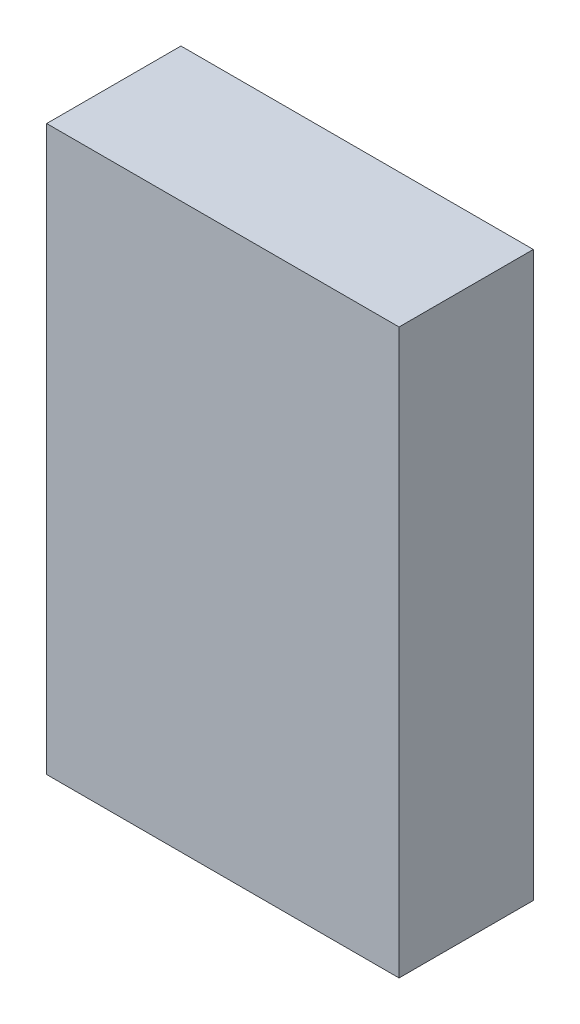
ISO-10303-21;
HEADER;
FILE_DESCRIPTION(('STEP AP214'),'2;1');
FILE_NAME('part.step','',(''),(''),'','','');
FILE_SCHEMA(('AUTOMOTIVE_DESIGN { 1 0 10303 214 1 1 1 1 }'));
ENDSEC;
DATA;
#1=APPLICATION_CONTEXT('core data for automotive mechanical design processes');
#2=APPLICATION_PROTOCOL_DEFINITION('international standard','automotive_design',2000,#1);
#3=PRODUCT_CONTEXT('',#1,'mechanical');
#4=PRODUCT('Part','Part','',(#3));
#5=PRODUCT_RELATED_PRODUCT_CATEGORY('part','',(#4));
#6=PRODUCT_DEFINITION_FORMATION('','',#4);
#7=PRODUCT_DEFINITION_CONTEXT('part definition',#1,'design');
#8=PRODUCT_DEFINITION('design','',#6,#7);
#9=PRODUCT_DEFINITION_SHAPE('','',#8);
#10=(LENGTH_UNIT() NAMED_UNIT(*) SI_UNIT(.MILLI.,.METRE.));
#11=(NAMED_UNIT(*) PLANE_ANGLE_UNIT() SI_UNIT($,.RADIAN.));
#12=(NAMED_UNIT(*) SI_UNIT($,.STERADIAN.) SOLID_ANGLE_UNIT());
#13=UNCERTAINTY_MEASURE_WITH_UNIT(LENGTH_MEASURE(1.E-05),#10,'distance_accuracy_value','');
#14=(GEOMETRIC_REPRESENTATION_CONTEXT(3) GLOBAL_UNCERTAINTY_ASSIGNED_CONTEXT((#13)) GLOBAL_UNIT_ASSIGNED_CONTEXT((#10,
#11,#12)) REPRESENTATION_CONTEXT('',''));
#15=CARTESIAN_POINT('',(0.,0.,0.));
#16=DIRECTION('',(0.,0.,1.));
#17=DIRECTION('',(1.,0.,0.));
#18=AXIS2_PLACEMENT_3D('',#15,#16,#17);
#19=CARTESIAN_POINT('',(12.5,20.,9.525));
#20=DIRECTION('',(-1.,0.,0.));
#21=DIRECTION('',(0.,-1.,0.));
#22=AXIS2_PLACEMENT_3D('',#19,#20,#21);
#23=PLANE('',#22);
#24=DIRECTION('',(0.,1.,0.));
#25=VECTOR('',#24,1.);
#26=CARTESIAN_POINT('',(12.5,20.,0.));
#27=LINE('',#26,#25);
#28=CARTESIAN_POINT('',(12.5,-20.,0.));
#29=VERTEX_POINT('',#28);
#30=CARTESIAN_POINT('',(12.5,20.,0.));
#31=VERTEX_POINT('',#30);
#32=EDGE_CURVE('E97',#29,#31,#27,.T.);
#33=ORIENTED_EDGE('',*,*,#32,.T.);
#34=DIRECTION('',(0.,0.,-1.));
#35=VECTOR('',#34,1.);
#36=CARTESIAN_POINT('',(12.5,20.,9.525));
#37=LINE('',#36,#35);
#38=CARTESIAN_POINT('',(12.5,20.,9.525));
#39=VERTEX_POINT('',#38);
#40=EDGE_CURVE('E11',#39,#31,#37,.T.);
#41=ORIENTED_EDGE('',*,*,#40,.F.);
#42=DIRECTION('',(0.,1.,0.));
#43=VECTOR('',#42,1.);
#44=CARTESIAN_POINT('',(12.5,20.,9.525));
#45=LINE('',#44,#43);
#46=CARTESIAN_POINT('',(12.5,-20.,9.525));
#47=VERTEX_POINT('',#46);
#48=EDGE_CURVE('E85',#47,#39,#45,.T.);
#49=ORIENTED_EDGE('',*,*,#48,.F.);
#50=DIRECTION('',(0.,0.,-1.));
#51=VECTOR('',#50,1.);
#52=CARTESIAN_POINT('',(12.5,-20.,9.525));
#53=LINE('',#52,#51);
#54=EDGE_CURVE('E93',#47,#29,#53,.T.);
#55=ORIENTED_EDGE('',*,*,#54,.T.);
#56=EDGE_LOOP('',(#33,#41,#49,#55));
#57=FACE_BOUND('',#56,.T.);
#58=ADVANCED_FACE('F34',(#57),#23,.F.);
#59=CARTESIAN_POINT('',(-12.5,20.,9.525));
#60=DIRECTION('',(0.,-1.,0.));
#61=DIRECTION('',(0.,0.,-1.));
#62=AXIS2_PLACEMENT_3D('',#59,#60,#61);
#63=PLANE('',#62);
#64=DIRECTION('',(-1.,0.,0.));
#65=VECTOR('',#64,1.);
#66=CARTESIAN_POINT('',(-12.5,20.,0.));
#67=LINE('',#66,#65);
#68=CARTESIAN_POINT('',(-12.5,20.,0.));
#69=VERTEX_POINT('',#68);
#70=EDGE_CURVE('E89',#31,#69,#67,.T.);
#71=ORIENTED_EDGE('',*,*,#70,.T.);
#72=DIRECTION('',(0.,0.,-1.));
#73=VECTOR('',#72,1.);
#74=CARTESIAN_POINT('',(-12.5,20.,9.525));
#75=LINE('',#74,#73);
#76=CARTESIAN_POINT('',(-12.5,20.,9.525));
#77=VERTEX_POINT('',#76);
#78=EDGE_CURVE('E42',#77,#69,#75,.T.);
#79=ORIENTED_EDGE('',*,*,#78,.F.);
#80=DIRECTION('',(-1.,0.,0.));
#81=VECTOR('',#80,1.);
#82=CARTESIAN_POINT('',(-12.5,20.,9.525));
#83=LINE('',#82,#81);
#84=EDGE_CURVE('E80',#39,#77,#83,.T.);
#85=ORIENTED_EDGE('',*,*,#84,.F.);
#86=ORIENTED_EDGE('',*,*,#40,.T.);
#87=EDGE_LOOP('',(#71,#79,#85,#86));
#88=FACE_BOUND('',#87,.T.);
#89=ADVANCED_FACE('F88',(#88),#63,.F.);
#90=CARTESIAN_POINT('',(-12.5,20.,9.525));
#91=DIRECTION('',(1.,0.,0.));
#92=DIRECTION('',(0.,1.,0.));
#93=AXIS2_PLACEMENT_3D('',#90,#91,#92);
#94=PLANE('',#93);
#95=DIRECTION('',(0.,-1.,0.));
#96=VECTOR('',#95,1.);
#97=CARTESIAN_POINT('',(-12.5,20.,0.));
#98=LINE('',#97,#96);
#99=CARTESIAN_POINT('',(-12.5,-20.,0.));
#100=VERTEX_POINT('',#99);
#101=EDGE_CURVE('E67',#69,#100,#98,.T.);
#102=ORIENTED_EDGE('',*,*,#101,.T.);
#103=DIRECTION('',(0.,0.,-1.));
#104=VECTOR('',#103,1.);
#105=CARTESIAN_POINT('',(-12.5,-20.,9.525));
#106=LINE('',#105,#104);
#107=CARTESIAN_POINT('',(-12.5,-20.,9.525));
#108=VERTEX_POINT('',#107);
#109=EDGE_CURVE('E90',#108,#100,#106,.T.);
#110=ORIENTED_EDGE('',*,*,#109,.F.);
#111=DIRECTION('',(0.,-1.,0.));
#112=VECTOR('',#111,1.);
#113=CARTESIAN_POINT('',(-12.5,20.,9.525));
#114=LINE('',#113,#112);
#115=EDGE_CURVE('E83',#77,#108,#114,.T.);
#116=ORIENTED_EDGE('',*,*,#115,.F.);
#117=ORIENTED_EDGE('',*,*,#78,.T.);
#118=EDGE_LOOP('',(#102,#110,#116,#117));
#119=FACE_BOUND('',#118,.T.);
#120=ADVANCED_FACE('F91',(#119),#94,.F.);
#121=CARTESIAN_POINT('',(-12.5,-20.,9.525));
#122=DIRECTION('',(0.,1.,0.));
#123=DIRECTION('',(0.,0.,1.));
#124=AXIS2_PLACEMENT_3D('',#121,#122,#123);
#125=PLANE('',#124);
#126=DIRECTION('',(1.,0.,0.));
#127=VECTOR('',#126,1.);
#128=CARTESIAN_POINT('',(-12.5,-20.,0.));
#129=LINE('',#128,#127);
#130=EDGE_CURVE('E73',#100,#29,#129,.T.);
#131=ORIENTED_EDGE('',*,*,#130,.T.);
#132=ORIENTED_EDGE('',*,*,#54,.F.);
#133=DIRECTION('',(1.,0.,0.));
#134=VECTOR('',#133,1.);
#135=CARTESIAN_POINT('',(-12.5,-20.,9.525));
#136=LINE('',#135,#134);
#137=EDGE_CURVE('E50',#108,#47,#136,.T.);
#138=ORIENTED_EDGE('',*,*,#137,.F.);
#139=ORIENTED_EDGE('',*,*,#109,.T.);
#140=EDGE_LOOP('',(#131,#132,#138,#139));
#141=FACE_BOUND('',#140,.T.);
#142=ADVANCED_FACE('F104',(#141),#125,.F.);
#143=CARTESIAN_POINT('',(0.,0.,9.525));
#144=DIRECTION('',(0.,0.,1.));
#145=DIRECTION('',(1.,0.,0.));
#146=AXIS2_PLACEMENT_3D('',#143,#144,#145);
#147=PLANE('',#146);
#148=ORIENTED_EDGE('',*,*,#48,.T.);
#149=ORIENTED_EDGE('',*,*,#84,.T.);
#150=ORIENTED_EDGE('',*,*,#115,.T.);
#151=ORIENTED_EDGE('',*,*,#137,.T.);
#152=EDGE_LOOP('',(#148,#149,#150,#151));
#153=FACE_BOUND('',#152,.T.);
#154=ADVANCED_FACE('F81',(#153),#147,.T.);
#155=CARTESIAN_POINT('',(0.,0.,0.));
#156=DIRECTION('',(0.,0.,1.));
#157=DIRECTION('',(1.,0.,0.));
#158=AXIS2_PLACEMENT_3D('',#155,#156,#157);
#159=PLANE('',#158);
#160=ORIENTED_EDGE('',*,*,#32,.F.);
#161=ORIENTED_EDGE('',*,*,#130,.F.);
#162=ORIENTED_EDGE('',*,*,#101,.F.);
#163=ORIENTED_EDGE('',*,*,#70,.F.);
#164=EDGE_LOOP('',(#160,#161,#162,#163));
#165=FACE_BOUND('',#164,.T.);
#166=ADVANCED_FACE('F107',(#165),#159,.F.);
#167=CLOSED_SHELL('',(#58,#89,#120,#142,#154,#166));
#168=MANIFOLD_SOLID_BREP('B2',#167);
#169=ADVANCED_BREP_SHAPE_REPRESENTATION('',(#18,#168),#14);
#170=SHAPE_DEFINITION_REPRESENTATION(#9,#169);
ENDSEC;
END-ISO-10303-21;
